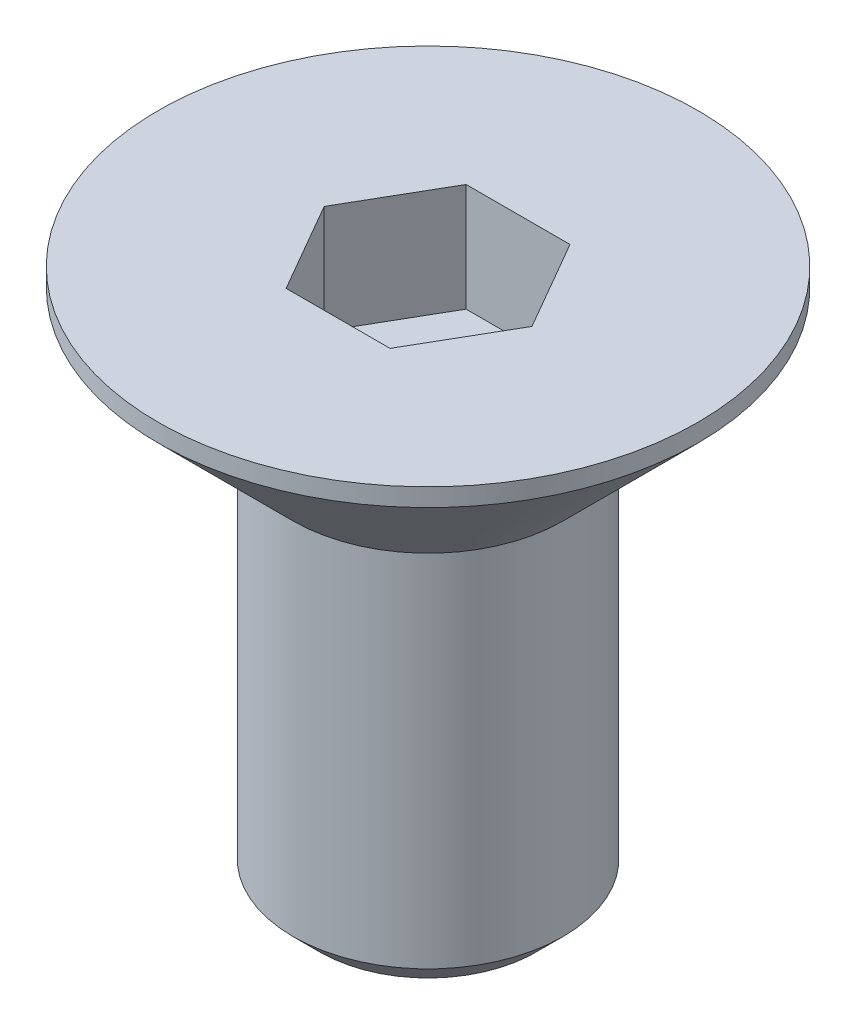
ISO-10303-21;
HEADER;
FILE_DESCRIPTION(('STEP AP214'),'2;1');
FILE_NAME('part.step','',(''),(''),'','','');
FILE_SCHEMA(('AUTOMOTIVE_DESIGN { 1 0 10303 214 1 1 1 1 }'));
ENDSEC;
DATA;
#1=APPLICATION_CONTEXT('core data for automotive mechanical design processes');
#2=APPLICATION_PROTOCOL_DEFINITION('international standard','automotive_design',2000,#1);
#3=PRODUCT_CONTEXT('',#1,'mechanical');
#4=PRODUCT('Part','Part','',(#3));
#5=PRODUCT_RELATED_PRODUCT_CATEGORY('part','',(#4));
#6=PRODUCT_DEFINITION_FORMATION('','',#4);
#7=PRODUCT_DEFINITION_CONTEXT('part definition',#1,'design');
#8=PRODUCT_DEFINITION('design','',#6,#7);
#9=PRODUCT_DEFINITION_SHAPE('','',#8);
#10=(LENGTH_UNIT() NAMED_UNIT(*) SI_UNIT(.MILLI.,.METRE.));
#11=(NAMED_UNIT(*) PLANE_ANGLE_UNIT() SI_UNIT($,.RADIAN.));
#12=(NAMED_UNIT(*) SI_UNIT($,.STERADIAN.) SOLID_ANGLE_UNIT());
#13=UNCERTAINTY_MEASURE_WITH_UNIT(LENGTH_MEASURE(1.E-05),#10,'distance_accuracy_value','');
#14=(GEOMETRIC_REPRESENTATION_CONTEXT(3) GLOBAL_UNCERTAINTY_ASSIGNED_CONTEXT((#13)) GLOBAL_UNIT_ASSIGNED_CONTEXT((#10,
#11,#12)) REPRESENTATION_CONTEXT('',''));
#15=CARTESIAN_POINT('',(0.,0.,0.));
#16=DIRECTION('',(0.,0.,1.));
#17=DIRECTION('',(1.,0.,0.));
#18=AXIS2_PLACEMENT_3D('',#15,#16,#17);
#19=CARTESIAN_POINT('',(0.,-4.3,0.));
#20=DIRECTION('',(0.,-1.,0.));
#21=DIRECTION('',(1.,0.,0.));
#22=AXIS2_PLACEMENT_3D('',#19,#20,#21);
#23=PLANE('',#22);
#24=CARTESIAN_POINT('',(0.,-4.30000000000064,0.));
#25=DIRECTION('',(0.,1.,0.));
#26=DIRECTION('',(0.,0.,1.));
#27=AXIS2_PLACEMENT_3D('',#24,#25,#26);
#28=CIRCLE('',#27,1.199999999983);
#29=CARTESIAN_POINT('',(0.,-4.30000000000064,1.199999999983));
#30=VERTEX_POINT('',#29);
#31=EDGE_CURVE('E19',#30,#30,#28,.T.);
#32=ORIENTED_EDGE('',*,*,#31,.F.);
#33=EDGE_LOOP('',(#32));
#34=FACE_BOUND('',#33,.T.);
#35=ADVANCED_FACE('F16',(#34),#23,.T.);
#36=CARTESIAN_POINT('',(0.,-3.99999999996226,0.));
#37=DIRECTION('',(0.,1.,0.));
#38=DIRECTION('',(0.,0.,1.));
#39=AXIS2_PLACEMENT_3D('',#36,#37,#38);
#40=CONICAL_SURFACE('',#39,1.50000000002138,0.785398163397448);
#41=ORIENTED_EDGE('',*,*,#31,.T.);
#42=EDGE_LOOP('',(#41));
#43=FACE_BOUND('',#42,.T.);
#44=CARTESIAN_POINT('',(0.,-4.,0.));
#45=DIRECTION('',(0.,-1.,0.));
#46=DIRECTION('',(1.,0.,0.));
#47=AXIS2_PLACEMENT_3D('',#44,#45,#46);
#48=CIRCLE('',#47,1.5);
#49=CARTESIAN_POINT('',(1.5,-4.,0.));
#50=VERTEX_POINT('',#49);
#51=EDGE_CURVE('E101',#50,#50,#48,.F.);
#52=ORIENTED_EDGE('',*,*,#51,.F.);
#53=EDGE_LOOP('',(#52));
#54=FACE_BOUND('',#53,.T.);
#55=ADVANCED_FACE('F108',(#43,#54),#40,.T.);
#56=CARTESIAN_POINT('',(0.,-4.3,0.));
#57=DIRECTION('',(0.,-1.,0.));
#58=DIRECTION('',(1.,0.,0.));
#59=AXIS2_PLACEMENT_3D('',#56,#57,#58);
#60=CYLINDRICAL_SURFACE('',#59,1.5);
#61=CARTESIAN_POINT('',(0.,0.,0.));
#62=DIRECTION('',(0.,1.,0.));
#63=DIRECTION('',(-1.,0.,0.));
#64=AXIS2_PLACEMENT_3D('',#61,#62,#63);
#65=CIRCLE('',#64,1.50000000002138);
#66=CARTESIAN_POINT('',(-1.50000000002137,0.,0.));
#67=VERTEX_POINT('',#66);
#68=EDGE_CURVE('E84',#67,#67,#65,.T.);
#69=ORIENTED_EDGE('',*,*,#68,.F.);
#70=EDGE_LOOP('',(#69));
#71=FACE_BOUND('',#70,.T.);
#72=ORIENTED_EDGE('',*,*,#51,.T.);
#73=EDGE_LOOP('',(#72));
#74=FACE_BOUND('',#73,.T.);
#75=ADVANCED_FACE('F116',(#71,#74),#60,.T.);
#76=CARTESIAN_POINT('',(1.73205080756888,0.5,1.));
#77=DIRECTION('',(0.,1.,0.));
#78=DIRECTION('',(-1.,0.,0.));
#79=AXIS2_PLACEMENT_3D('',#76,#77,#78);
#80=PLANE('',#79);
#81=DIRECTION('',(1.,0.,0.));
#82=VECTOR('',#81,1.);
#83=CARTESIAN_POINT('',(0.577350269189626,0.5,1.));
#84=LINE('',#83,#82);
#85=CARTESIAN_POINT('',(-0.577350269189623,0.5,1.));
#86=VERTEX_POINT('',#85);
#87=CARTESIAN_POINT('',(0.577350269189627,0.5,0.999999999999999));
#88=VERTEX_POINT('',#87);
#89=EDGE_CURVE('E66',#86,#88,#84,.T.);
#90=ORIENTED_EDGE('',*,*,#89,.T.);
#91=DIRECTION('',(0.499999999999998,0.,-0.86602540378444));
#92=VECTOR('',#91,1.);
#93=CARTESIAN_POINT('',(1.15470053837925,0.5,0.));
#94=LINE('',#93,#92);
#95=CARTESIAN_POINT('',(1.15470053837925,0.5,0.));
#96=VERTEX_POINT('',#95);
#97=EDGE_CURVE('E68',#88,#96,#94,.T.);
#98=ORIENTED_EDGE('',*,*,#97,.T.);
#99=DIRECTION('',(-0.5,0.,-0.866025403784439));
#100=VECTOR('',#99,1.);
#101=CARTESIAN_POINT('',(1.15470053837925,0.5,0.));
#102=LINE('',#101,#100);
#103=CARTESIAN_POINT('',(0.577350269189625,0.500000000000013,-1.));
#104=VERTEX_POINT('',#103);
#105=EDGE_CURVE('E71',#96,#104,#102,.T.);
#106=ORIENTED_EDGE('',*,*,#105,.T.);
#107=DIRECTION('',(-1.,0.,0.));
#108=VECTOR('',#107,1.);
#109=CARTESIAN_POINT('',(0.577350269189626,0.500000000000049,-1.));
#110=LINE('',#109,#108);
#111=CARTESIAN_POINT('',(-0.577350269189626,0.500000000000025,-1.));
#112=VERTEX_POINT('',#111);
#113=EDGE_CURVE('E290',#104,#112,#110,.T.);
#114=ORIENTED_EDGE('',*,*,#113,.T.);
#115=DIRECTION('',(-0.499999999999999,0.,0.866025403784439));
#116=VECTOR('',#115,1.);
#117=CARTESIAN_POINT('',(-0.577350269189626,0.500000000000049,-1.));
#118=LINE('',#117,#116);
#119=CARTESIAN_POINT('',(-1.15470053837925,0.500000000000013,0.));
#120=VERTEX_POINT('',#119);
#121=EDGE_CURVE('E285',#112,#120,#118,.T.);
#122=ORIENTED_EDGE('',*,*,#121,.T.);
#123=DIRECTION('',(0.499999999999999,0.,0.866025403784439));
#124=VECTOR('',#123,1.);
#125=CARTESIAN_POINT('',(-0.577350269189626,0.5,1.));
#126=LINE('',#125,#124);
#127=EDGE_CURVE('E280',#120,#86,#126,.T.);
#128=ORIENTED_EDGE('',*,*,#127,.T.);
#129=EDGE_LOOP('',(#90,#98,#106,#114,#122,#128));
#130=FACE_BOUND('',#129,.T.);
#131=ADVANCED_FACE('F70',(#130),#80,.T.);
#132=CARTESIAN_POINT('',(0.,1.499999999794,0.));
#133=DIRECTION('',(0.,1.,0.));
#134=DIRECTION('',(-1.,0.,0.));
#135=AXIS2_PLACEMENT_3D('',#132,#133,#134);
#136=CONICAL_SURFACE('',#135,2.99999999975853,0.785398163378501);
#137=ORIENTED_EDGE('',*,*,#68,.T.);
#138=EDGE_LOOP('',(#137));
#139=FACE_BOUND('',#138,.T.);
#140=CARTESIAN_POINT('',(0.,1.49999999999999,0.));
#141=DIRECTION('',(0.,-1.,0.));
#142=DIRECTION('',(1.,0.,0.));
#143=AXIS2_PLACEMENT_3D('',#140,#141,#142);
#144=CIRCLE('',#143,3.);
#145=CARTESIAN_POINT('',(3.,1.49999999999999,0.));
#146=VERTEX_POINT('',#145);
#147=EDGE_CURVE('E95',#146,#146,#144,.F.);
#148=ORIENTED_EDGE('',*,*,#147,.F.);
#149=EDGE_LOOP('',(#148));
#150=FACE_BOUND('',#149,.T.);
#151=ADVANCED_FACE('F148',(#139,#150),#136,.T.);
#152=CARTESIAN_POINT('',(1.15470053837925,0.5,0.));
#153=DIRECTION('',(0.866025403784439,0.,-0.5));
#154=DIRECTION('',(-0.5,0.,-0.866025403784439));
#155=AXIS2_PLACEMENT_3D('',#152,#153,#154);
#156=PLANE('',#155);
#157=DIRECTION('',(0.,1.,0.));
#158=VECTOR('',#157,1.);
#159=CARTESIAN_POINT('',(0.577350269189626,0.500000000000049,-1.));
#160=LINE('',#159,#158);
#161=CARTESIAN_POINT('',(0.577350269189625,1.70000000000004,-1.));
#162=VERTEX_POINT('',#161);
#163=EDGE_CURVE('E82',#162,#104,#160,.F.);
#164=ORIENTED_EDGE('',*,*,#163,.T.);
#165=ORIENTED_EDGE('',*,*,#105,.F.);
#166=DIRECTION('',(0.,1.,0.));
#167=VECTOR('',#166,1.);
#168=CARTESIAN_POINT('',(1.15470053837925,0.5,0.));
#169=LINE('',#168,#167);
#170=CARTESIAN_POINT('',(1.15470053837925,1.70000000000002,0.));
#171=VERTEX_POINT('',#170);
#172=EDGE_CURVE('E76',#96,#171,#169,.T.);
#173=ORIENTED_EDGE('',*,*,#172,.T.);
#174=DIRECTION('',(0.500000000000007,0.,0.866025403784435));
#175=VECTOR('',#174,1.);
#176=CARTESIAN_POINT('',(0.577350269189626,1.7,-1.));
#177=LINE('',#176,#175);
#178=EDGE_CURVE('E98',#162,#171,#177,.T.);
#179=ORIENTED_EDGE('',*,*,#178,.F.);
#180=EDGE_LOOP('',(#164,#165,#173,#179));
#181=FACE_BOUND('',#180,.T.);
#182=ADVANCED_FACE('F79',(#181),#156,.F.);
#183=CARTESIAN_POINT('',(1.15470053837925,0.5,0.));
#184=DIRECTION('',(0.86602540378444,0.,0.499999999999998));
#185=DIRECTION('',(0.499999999999998,0.,-0.86602540378444));
#186=AXIS2_PLACEMENT_3D('',#183,#184,#185);
#187=PLANE('',#186);
#188=ORIENTED_EDGE('',*,*,#172,.F.);
#189=ORIENTED_EDGE('',*,*,#97,.F.);
#190=DIRECTION('',(0.,-1.,0.));
#191=VECTOR('',#190,1.);
#192=CARTESIAN_POINT('',(0.577350269189626,0.5,1.));
#193=LINE('',#192,#191);
#194=CARTESIAN_POINT('',(0.577350269189631,1.7,0.999999999999998));
#195=VERTEX_POINT('',#194);
#196=EDGE_CURVE('E91',#88,#195,#193,.F.);
#197=ORIENTED_EDGE('',*,*,#196,.T.);
#198=DIRECTION('',(-0.499999999999998,0.,0.86602540378444));
#199=VECTOR('',#198,1.);
#200=CARTESIAN_POINT('',(1.15470053837926,1.7,0.));
#201=LINE('',#200,#199);
#202=EDGE_CURVE('E88',#171,#195,#201,.T.);
#203=ORIENTED_EDGE('',*,*,#202,.F.);
#204=EDGE_LOOP('',(#188,#189,#197,#203));
#205=FACE_BOUND('',#204,.T.);
#206=ADVANCED_FACE('F86',(#205),#187,.F.);
#207=CARTESIAN_POINT('',(0.577350269189626,0.5,1.));
#208=DIRECTION('',(0.,0.,1.));
#209=DIRECTION('',(0.,-1.,0.));
#210=AXIS2_PLACEMENT_3D('',#207,#208,#209);
#211=PLANE('',#210);
#212=ORIENTED_EDGE('',*,*,#196,.F.);
#213=ORIENTED_EDGE('',*,*,#89,.F.);
#214=DIRECTION('',(0.,1.,0.));
#215=VECTOR('',#214,1.);
#216=CARTESIAN_POINT('',(-0.577350269189626,0.5,1.));
#217=LINE('',#216,#215);
#218=CARTESIAN_POINT('',(-0.577350269189616,1.7,1.));
#219=VERTEX_POINT('',#218);
#220=EDGE_CURVE('E281',#86,#219,#217,.T.);
#221=ORIENTED_EDGE('',*,*,#220,.T.);
#222=DIRECTION('',(-1.,0.,0.));
#223=VECTOR('',#222,1.);
#224=CARTESIAN_POINT('',(3.,1.7,1.));
#225=LINE('',#224,#223);
#226=EDGE_CURVE('E279',#195,#219,#225,.T.);
#227=ORIENTED_EDGE('',*,*,#226,.F.);
#228=EDGE_LOOP('',(#212,#213,#221,#227));
#229=FACE_BOUND('',#228,.T.);
#230=ADVANCED_FACE('F139',(#229),#211,.F.);
#231=CARTESIAN_POINT('',(-0.577350269189626,0.5,1.));
#232=DIRECTION('',(-0.866025403784439,0.,0.499999999999999));
#233=DIRECTION('',(0.499999999999999,0.,0.866025403784439));
#234=AXIS2_PLACEMENT_3D('',#231,#232,#233);
#235=PLANE('',#234);
#236=ORIENTED_EDGE('',*,*,#220,.F.);
#237=ORIENTED_EDGE('',*,*,#127,.F.);
#238=DIRECTION('',(0.,1.,0.));
#239=VECTOR('',#238,1.);
#240=CARTESIAN_POINT('',(-1.15470053837925,0.500000000000049,0.));
#241=LINE('',#240,#239);
#242=CARTESIAN_POINT('',(-1.15470053837924,1.7,0.));
#243=VERTEX_POINT('',#242);
#244=EDGE_CURVE('E287',#120,#243,#241,.T.);
#245=ORIENTED_EDGE('',*,*,#244,.T.);
#246=DIRECTION('',(-0.499999999999998,0.,-0.86602540378444));
#247=VECTOR('',#246,1.);
#248=CARTESIAN_POINT('',(-0.577350269189612,1.7,1.));
#249=LINE('',#248,#247);
#250=EDGE_CURVE('E296',#219,#243,#249,.T.);
#251=ORIENTED_EDGE('',*,*,#250,.F.);
#252=EDGE_LOOP('',(#236,#237,#245,#251));
#253=FACE_BOUND('',#252,.T.);
#254=ADVANCED_FACE('F136',(#253),#235,.F.);
#255=CARTESIAN_POINT('',(-0.577350269189626,0.500000000000049,-1.));
#256=DIRECTION('',(-0.866025403784439,0.,-0.499999999999999));
#257=DIRECTION('',(-0.499999999999999,0.,0.866025403784439));
#258=AXIS2_PLACEMENT_3D('',#255,#256,#257);
#259=PLANE('',#258);
#260=ORIENTED_EDGE('',*,*,#244,.F.);
#261=ORIENTED_EDGE('',*,*,#121,.F.);
#262=DIRECTION('',(0.,1.,0.));
#263=VECTOR('',#262,1.);
#264=CARTESIAN_POINT('',(-0.577350269189626,0.500000000000049,-1.));
#265=LINE('',#264,#263);
#266=CARTESIAN_POINT('',(-0.577350269189626,1.70000000000001,-1.));
#267=VERTEX_POINT('',#266);
#268=EDGE_CURVE('E33',#112,#267,#265,.T.);
#269=ORIENTED_EDGE('',*,*,#268,.T.);
#270=DIRECTION('',(0.499999999999989,0.,-0.866025403784445));
#271=VECTOR('',#270,1.);
#272=CARTESIAN_POINT('',(-1.15470053837924,1.7,0.));
#273=LINE('',#272,#271);
#274=EDGE_CURVE('E299',#243,#267,#273,.T.);
#275=ORIENTED_EDGE('',*,*,#274,.F.);
#276=EDGE_LOOP('',(#260,#261,#269,#275));
#277=FACE_BOUND('',#276,.T.);
#278=ADVANCED_FACE('F132',(#277),#259,.F.);
#279=CARTESIAN_POINT('',(0.577350269189626,0.500000000000049,-1.));
#280=DIRECTION('',(0.,0.,-1.));
#281=DIRECTION('',(-1.,0.,0.));
#282=AXIS2_PLACEMENT_3D('',#279,#280,#281);
#283=PLANE('',#282);
#284=ORIENTED_EDGE('',*,*,#268,.F.);
#285=ORIENTED_EDGE('',*,*,#113,.F.);
#286=ORIENTED_EDGE('',*,*,#163,.F.);
#287=DIRECTION('',(-1.,0.,0.));
#288=VECTOR('',#287,1.);
#289=CARTESIAN_POINT('',(3.,1.7,-1.));
#290=LINE('',#289,#288);
#291=EDGE_CURVE('E25',#267,#162,#290,.F.);
#292=ORIENTED_EDGE('',*,*,#291,.F.);
#293=EDGE_LOOP('',(#284,#285,#286,#292));
#294=FACE_BOUND('',#293,.T.);
#295=ADVANCED_FACE('F125',(#294),#283,.F.);
#296=CARTESIAN_POINT('',(0.,-4.3,0.));
#297=DIRECTION('',(0.,-1.,0.));
#298=DIRECTION('',(1.,0.,0.));
#299=AXIS2_PLACEMENT_3D('',#296,#297,#298);
#300=CYLINDRICAL_SURFACE('',#299,3.);
#301=CARTESIAN_POINT('',(0.,1.7,0.));
#302=DIRECTION('',(0.,-1.,0.));
#303=DIRECTION('',(1.,0.,0.));
#304=AXIS2_PLACEMENT_3D('',#301,#302,#303);
#305=CIRCLE('',#304,3.);
#306=CARTESIAN_POINT('',(3.,1.7,0.));
#307=VERTEX_POINT('',#306);
#308=EDGE_CURVE('E11',#307,#307,#305,.F.);
#309=ORIENTED_EDGE('',*,*,#308,.F.);
#310=EDGE_LOOP('',(#309));
#311=FACE_BOUND('',#310,.T.);
#312=ORIENTED_EDGE('',*,*,#147,.T.);
#313=EDGE_LOOP('',(#312));
#314=FACE_BOUND('',#313,.T.);
#315=ADVANCED_FACE('F119',(#311,#314),#300,.T.);
#316=CARTESIAN_POINT('',(3.,1.7,0.));
#317=DIRECTION('',(0.,1.,0.));
#318=DIRECTION('',(-1.,0.,0.));
#319=AXIS2_PLACEMENT_3D('',#316,#317,#318);
#320=PLANE('',#319);
#321=ORIENTED_EDGE('',*,*,#308,.T.);
#322=EDGE_LOOP('',(#321));
#323=FACE_BOUND('',#322,.T.);
#324=ORIENTED_EDGE('',*,*,#274,.T.);
#325=ORIENTED_EDGE('',*,*,#291,.T.);
#326=ORIENTED_EDGE('',*,*,#178,.T.);
#327=ORIENTED_EDGE('',*,*,#202,.T.);
#328=ORIENTED_EDGE('',*,*,#226,.T.);
#329=ORIENTED_EDGE('',*,*,#250,.T.);
#330=EDGE_LOOP('',(#324,#325,#326,#327,#328,#329));
#331=FACE_BOUND('',#330,.T.);
#332=ADVANCED_FACE('F117',(#323,#331),#320,.T.);
#333=CLOSED_SHELL('',(#35,#55,#75,#131,#151,#182,#206,#230,#254,#278,#295,#315,#332));
#334=MANIFOLD_SOLID_BREP('B1',#333);
#335=ADVANCED_BREP_SHAPE_REPRESENTATION('',(#18,#334),#14);
#336=SHAPE_DEFINITION_REPRESENTATION(#9,#335);
ENDSEC;
END-ISO-10303-21;
